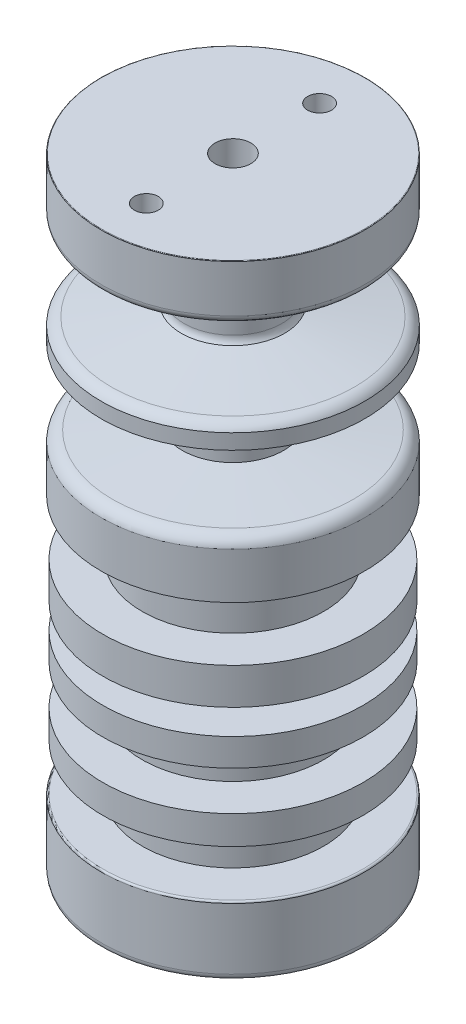
ISO-10303-21;
HEADER;
FILE_DESCRIPTION(('STEP AP214'),'2;1');
FILE_NAME('part.step','',(''),(''),'','','');
FILE_SCHEMA(('AUTOMOTIVE_DESIGN { 1 0 10303 214 1 1 1 1 }'));
ENDSEC;
DATA;
#1=APPLICATION_CONTEXT('core data for automotive mechanical design processes');
#2=APPLICATION_PROTOCOL_DEFINITION('international standard','automotive_design',2000,#1);
#3=PRODUCT_CONTEXT('',#1,'mechanical');
#4=PRODUCT('Part','Part','',(#3));
#5=PRODUCT_RELATED_PRODUCT_CATEGORY('part','',(#4));
#6=PRODUCT_DEFINITION_FORMATION('','',#4);
#7=PRODUCT_DEFINITION_CONTEXT('part definition',#1,'design');
#8=PRODUCT_DEFINITION('design','',#6,#7);
#9=PRODUCT_DEFINITION_SHAPE('','',#8);
#10=(LENGTH_UNIT() NAMED_UNIT(*) SI_UNIT(.MILLI.,.METRE.));
#11=(NAMED_UNIT(*) PLANE_ANGLE_UNIT() SI_UNIT($,.RADIAN.));
#12=(NAMED_UNIT(*) SI_UNIT($,.STERADIAN.) SOLID_ANGLE_UNIT());
#13=UNCERTAINTY_MEASURE_WITH_UNIT(LENGTH_MEASURE(1.E-05),#10,'distance_accuracy_value','');
#14=(GEOMETRIC_REPRESENTATION_CONTEXT(3) GLOBAL_UNCERTAINTY_ASSIGNED_CONTEXT((#13)) GLOBAL_UNIT_ASSIGNED_CONTEXT((#10,
#11,#12)) REPRESENTATION_CONTEXT('',''));
#15=CARTESIAN_POINT('',(0.,0.,0.));
#16=DIRECTION('',(0.,0.,1.));
#17=DIRECTION('',(1.,0.,0.));
#18=AXIS2_PLACEMENT_3D('',#15,#16,#17);
#19=CARTESIAN_POINT('',(0.,-121.955431754864,0.));
#20=DIRECTION('',(0.,-1.,0.));
#21=DIRECTION('',(1.,0.,0.));
#22=AXIS2_PLACEMENT_3D('',#19,#20,#21);
#23=CONICAL_SURFACE('',#22,0.,1.56977202903622);
#24=CARTESIAN_POINT('',(0.,-121.991013624139,0.));
#25=DIRECTION('',(0.,1.,0.));
#26=DIRECTION('',(-1.,0.,0.));
#27=AXIS2_PLACEMENT_3D('',#24,#25,#26);
#28=CIRCLE('',#27,34.7378060037741);
#29=CARTESIAN_POINT('',(34.7378060037709,-121.991013624139,0.));
#30=VERTEX_POINT('',#29);
#31=EDGE_CURVE('E137',#30,#30,#28,.T.);
#32=CARTESIAN_POINT('',(0.,-121.963562121167,0.));
#33=DIRECTION('',(0.,-1.,0.));
#34=DIRECTION('',(1.,0.,0.));
#35=AXIS2_PLACEMENT_3D('',#32,#33,#34);
#36=CIRCLE('',#35,7.9375);
#37=CARTESIAN_POINT('',(7.93749999999986,-121.963562121167,0.));
#38=VERTEX_POINT('',#37);
#39=EDGE_CURVE('E37',#38,#38,#36,.T.);
#40=CARTESIAN_POINT('',(34.7378060037709,-121.991013624139,0.));
#41=CARTESIAN_POINT('',(34.4586361495649,-121.990727670983,0.));
#42=CARTESIAN_POINT('',(34.179466295359,-121.990441717827,0.));
#43=CARTESIAN_POINT('',(33.6211265869471,-121.989869811515,0.));
#44=CARTESIAN_POINT('',(33.3419567327411,-121.989583858359,0.));
#45=CARTESIAN_POINT('',(32.7836170243292,-121.989011952047,0.));
#46=CARTESIAN_POINT('',(32.5044471701233,-121.988725998891,0.));
#47=CARTESIAN_POINT('',(31.9461074617114,-121.988154092579,0.));
#48=CARTESIAN_POINT('',(31.6669376075054,-121.987868139423,0.));
#49=CARTESIAN_POINT('',(31.1085978990935,-121.987296233111,0.));
#50=CARTESIAN_POINT('',(30.8294280448876,-121.987010279955,0.));
#51=CARTESIAN_POINT('',(30.2710883364757,-121.986438373643,0.));
#52=CARTESIAN_POINT('',(29.9919184822697,-121.986152420487,0.));
#53=CARTESIAN_POINT('',(29.4335787738579,-121.985580514175,0.));
#54=CARTESIAN_POINT('',(29.1544089196519,-121.985294561019,0.));
#55=CARTESIAN_POINT('',(28.59606921124,-121.984722654708,0.));
#56=CARTESIAN_POINT('',(28.3168993570341,-121.984436701552,0.));
#57=CARTESIAN_POINT('',(27.7585596486222,-121.98386479524,0.));
#58=CARTESIAN_POINT('',(27.4793897944162,-121.983578842084,0.));
#59=CARTESIAN_POINT('',(26.9210500860043,-121.983006935772,0.));
#60=CARTESIAN_POINT('',(26.6418802317984,-121.982720982616,0.));
#61=CARTESIAN_POINT('',(26.0835405233865,-121.982149076304,0.));
#62=CARTESIAN_POINT('',(25.8043706691805,-121.981863123148,0.));
#63=CARTESIAN_POINT('',(25.2460309607686,-121.981291216836,0.));
#64=CARTESIAN_POINT('',(24.9668611065627,-121.98100526368,0.));
#65=CARTESIAN_POINT('',(24.4085213981508,-121.980433357368,0.));
#66=CARTESIAN_POINT('',(24.1293515439448,-121.980147404212,0.));
#67=CARTESIAN_POINT('',(23.5710118355329,-121.9795754979,0.));
#68=CARTESIAN_POINT('',(23.291841981327,-121.979289544744,0.));
#69=CARTESIAN_POINT('',(22.7335022729151,-121.978717638432,0.));
#70=CARTESIAN_POINT('',(22.4543324187092,-121.978431685276,0.));
#71=CARTESIAN_POINT('',(21.8959927102973,-121.977859778965,0.));
#72=CARTESIAN_POINT('',(21.6168228560913,-121.977573825809,0.));
#73=CARTESIAN_POINT('',(21.0584831476794,-121.977001919497,0.));
#74=CARTESIAN_POINT('',(20.7793132934735,-121.976715966341,0.));
#75=CARTESIAN_POINT('',(20.2209735850616,-121.976144060029,0.));
#76=CARTESIAN_POINT('',(19.9418037308556,-121.975858106873,0.));
#77=CARTESIAN_POINT('',(19.3834640224437,-121.975286200561,0.));
#78=CARTESIAN_POINT('',(19.1042941682378,-121.975000247405,0.));
#79=CARTESIAN_POINT('',(18.5459544598259,-121.974428341093,0.));
#80=CARTESIAN_POINT('',(18.2667846056199,-121.974142387937,0.));
#81=CARTESIAN_POINT('',(17.708444897208,-121.973570481625,0.));
#82=CARTESIAN_POINT('',(17.4292750430021,-121.973284528469,0.));
#83=CARTESIAN_POINT('',(16.8709353345902,-121.972712622157,0.));
#84=CARTESIAN_POINT('',(16.5917654803842,-121.972426669001,0.));
#85=CARTESIAN_POINT('',(16.0334257719724,-121.971854762689,0.));
#86=CARTESIAN_POINT('',(15.7542559177664,-121.971568809533,0.));
#87=CARTESIAN_POINT('',(15.1959162093545,-121.970996903221,0.));
#88=CARTESIAN_POINT('',(14.9167463551486,-121.970710950066,0.));
#89=CARTESIAN_POINT('',(14.3584066467367,-121.970139043754,0.));
#90=CARTESIAN_POINT('',(14.0792367925307,-121.969853090598,0.));
#91=CARTESIAN_POINT('',(13.5208970841188,-121.969281184286,0.));
#92=CARTESIAN_POINT('',(13.2417272299129,-121.96899523113,0.));
#93=CARTESIAN_POINT('',(12.683387521501,-121.968423324818,0.));
#94=CARTESIAN_POINT('',(12.404217667295,-121.968137371662,0.));
#95=CARTESIAN_POINT('',(11.8458779588831,-121.96756546535,0.));
#96=CARTESIAN_POINT('',(11.5667081046772,-121.967279512194,0.));
#97=CARTESIAN_POINT('',(11.0083683962653,-121.966707605882,0.));
#98=CARTESIAN_POINT('',(10.7291985420593,-121.966421652726,0.));
#99=CARTESIAN_POINT('',(10.1708588336474,-121.965849746414,0.));
#100=CARTESIAN_POINT('',(9.8916889794415,-121.965563793258,0.));
#101=CARTESIAN_POINT('',(9.3333492710296,-121.964991886946,0.));
#102=CARTESIAN_POINT('',(9.05417941682365,-121.96470593379,0.));
#103=CARTESIAN_POINT('',(8.49583970841176,-121.964134027478,0.));
#104=CARTESIAN_POINT('',(8.21666985420581,-121.963848074323,0.));
#105=CARTESIAN_POINT('',(7.93749999999986,-121.963562121167,0.));
#106=B_SPLINE_CURVE_WITH_KNOTS('',3,(#40,#41,#42,#43,#44,#45,#46,#47,#48,#49,#50,#51,#52,#53,
#54,#55,#56,#57,#58,#59,#60,#61,#62,#63,#64,#65,#66,#67,#68,#69,#70,#71,#72,#73,#74,#75,#76,#77,
#78,#79,#80,#81,#82,#83,#84,#85,#86,#87,#88,#89,#90,#91,#92,#93,#94,#95,#96,#97,#98,#99,#100,
#101,#102,#103,#104,#105),.UNSPECIFIED.,.F.,.F.,(4,2,2,2,2,2,2,2,2,2,2,2,2,2,2,2,2,2,2,2,2,2,2,
2,2,2,2,2,2,2,2,2,4),(0.,0.837510001969652,1.6750200039393,2.51253000590894,3.35004000787859,
4.18755000984824,5.02506001181789,5.86257001378753,6.70008001575718,7.53759001772683,
8.37510001969648,9.21261002166612,10.0501200236358,10.8876300256054,11.7251400275751,
12.5626500295447,13.4001600315144,14.237670033484,15.0751800354537,15.9126900374233,
16.7502000393929,17.5877100413626,18.4252200433322,19.2627300453019,20.1002400472715,
20.9377500492412,21.7752600512108,22.6127700531805,23.4502800551501,24.2877900571198,
25.1253000590894,25.9628100610591,26.8003200630287),.UNSPECIFIED.);
#107=EDGE_CURVE('BSEAM33',#30,#38,#106,.T.);
#108=ORIENTED_EDGE('',*,*,#31,.F.);
#109=ORIENTED_EDGE('',*,*,#39,.F.);
#110=ORIENTED_EDGE('',*,*,#107,.T.);
#111=ORIENTED_EDGE('',*,*,#107,.F.);
#112=EDGE_LOOP('',(#108,#110,#109,#111));
#113=FACE_BOUND('',#112,.T.);
#114=ADVANCED_FACE('F33',(#113),#23,.F.);
#115=CARTESIAN_POINT('',(0.,43.0445682451364,0.));
#116=DIRECTION('',(0.,-1.,0.));
#117=DIRECTION('',(1.,0.,0.));
#118=AXIS2_PLACEMENT_3D('',#115,#116,#117);
#119=PLANE('',#118);
#120=CARTESIAN_POINT('',(0.,43.0445682451364,0.));
#121=DIRECTION('',(0.,1.,0.));
#122=DIRECTION('',(0.,0.,1.));
#123=AXIS2_PLACEMENT_3D('',#120,#121,#122);
#124=CIRCLE('',#123,4.7625);
#125=CARTESIAN_POINT('',(0.,43.0445682451364,4.7625));
#126=VERTEX_POINT('',#125);
#127=EDGE_CURVE('E153',#126,#126,#124,.T.);
#128=ORIENTED_EDGE('',*,*,#127,.F.);
#129=EDGE_LOOP('',(#128));
#130=FACE_BOUND('',#129,.T.);
#131=CARTESIAN_POINT('',(0.,43.0445682451364,23.));
#132=DIRECTION('',(0.,1.,0.));
#133=DIRECTION('',(0.,0.,1.));
#134=AXIS2_PLACEMENT_3D('',#131,#132,#133);
#135=CIRCLE('',#134,3.175);
#136=CARTESIAN_POINT('',(0.,43.0445682451364,26.175));
#137=VERTEX_POINT('',#136);
#138=EDGE_CURVE('E147',#137,#137,#135,.T.);
#139=ORIENTED_EDGE('',*,*,#138,.F.);
#140=EDGE_LOOP('',(#139));
#141=FACE_BOUND('',#140,.T.);
#142=CARTESIAN_POINT('',(0.,43.0445682451364,-23.));
#143=DIRECTION('',(0.,1.,0.));
#144=DIRECTION('',(0.,0.,1.));
#145=AXIS2_PLACEMENT_3D('',#142,#143,#144);
#146=CIRCLE('',#145,3.175);
#147=CARTESIAN_POINT('',(0.,43.0445682451364,-19.825));
#148=VERTEX_POINT('',#147);
#149=EDGE_CURVE('E141',#148,#148,#146,.T.);
#150=ORIENTED_EDGE('',*,*,#149,.F.);
#151=EDGE_LOOP('',(#150));
#152=FACE_BOUND('',#151,.T.);
#153=CARTESIAN_POINT('',(0.,43.0445682451364,0.));
#154=DIRECTION('',(0.,1.,0.));
#155=DIRECTION('',(-1.,0.,0.));
#156=AXIS2_PLACEMENT_3D('',#153,#154,#155);
#157=CIRCLE('',#156,34.8584196821975);
#158=CARTESIAN_POINT('',(-34.8584196821975,43.0445682451364,0.));
#159=VERTEX_POINT('',#158);
#160=EDGE_CURVE('E10',#159,#159,#157,.T.);
#161=ORIENTED_EDGE('',*,*,#160,.T.);
#162=EDGE_LOOP('',(#161));
#163=FACE_BOUND('',#162,.T.);
#164=ADVANCED_FACE('F35',(#130,#141,#152,#163),#119,.F.);
#165=CARTESIAN_POINT('',(0.,42.9029879273339,0.));
#166=DIRECTION('',(0.,1.,0.));
#167=DIRECTION('',(-1.,0.,0.));
#168=AXIS2_PLACEMENT_3D('',#165,#166,#167);
#169=TOROIDAL_SURFACE('',#168,34.8584196821975,0.141580317802481);
#170=ORIENTED_EDGE('',*,*,#160,.F.);
#171=EDGE_LOOP('',(#170));
#172=FACE_BOUND('',#171,.T.);
#173=CARTESIAN_POINT('',(0.,42.9029879273339,0.));
#174=DIRECTION('',(0.,1.,0.));
#175=DIRECTION('',(-1.,0.,0.));
#176=AXIS2_PLACEMENT_3D('',#173,#174,#175);
#177=CIRCLE('',#176,35.);
#178=CARTESIAN_POINT('',(-35.,42.9029879273339,0.));
#179=VERTEX_POINT('',#178);
#180=EDGE_CURVE('E41',#179,#179,#177,.T.);
#181=ORIENTED_EDGE('',*,*,#180,.T.);
#182=EDGE_LOOP('',(#181));
#183=FACE_BOUND('',#182,.T.);
#184=ADVANCED_FACE('F173',(#172,#183),#169,.T.);
#185=CARTESIAN_POINT('',(0.,43.0445682451364,0.));
#186=DIRECTION('',(0.,1.,0.));
#187=DIRECTION('',(-1.,0.,0.));
#188=AXIS2_PLACEMENT_3D('',#185,#186,#187);
#189=CYLINDRICAL_SURFACE('',#188,35.);
#190=ORIENTED_EDGE('',*,*,#180,.F.);
#191=EDGE_LOOP('',(#190));
#192=FACE_BOUND('',#191,.T.);
#193=CARTESIAN_POINT('',(0.,30.3660149299546,0.));
#194=DIRECTION('',(0.,1.,0.));
#195=DIRECTION('',(-1.,0.,0.));
#196=AXIS2_PLACEMENT_3D('',#193,#194,#195);
#197=CIRCLE('',#196,35.);
#198=CARTESIAN_POINT('',(-35.,30.3660149299546,0.));
#199=VERTEX_POINT('',#198);
#200=EDGE_CURVE('E45',#199,#199,#197,.T.);
#201=ORIENTED_EDGE('',*,*,#200,.T.);
#202=EDGE_LOOP('',(#201));
#203=FACE_BOUND('',#202,.T.);
#204=ADVANCED_FACE('F299',(#192,#203),#189,.T.);
#205=CARTESIAN_POINT('',(0.,30.3660149299546,0.));
#206=DIRECTION('',(0.,1.,0.));
#207=DIRECTION('',(-1.,0.,0.));
#208=AXIS2_PLACEMENT_3D('',#205,#206,#207);
#209=TOROIDAL_SURFACE('',#208,32.9643531045201,2.03564689547988);
#210=ORIENTED_EDGE('',*,*,#200,.F.);
#211=EDGE_LOOP('',(#210));
#212=FACE_BOUND('',#211,.T.);
#213=CARTESIAN_POINT('',(0.,28.3303680344748,0.));
#214=DIRECTION('',(0.,1.,0.));
#215=DIRECTION('',(-1.,0.,0.));
#216=AXIS2_PLACEMENT_3D('',#213,#214,#215);
#217=CIRCLE('',#216,32.9643531045201);
#218=CARTESIAN_POINT('',(-32.9643531045201,28.3303680344747,0.));
#219=VERTEX_POINT('',#218);
#220=EDGE_CURVE('E50',#219,#219,#217,.T.);
#221=ORIENTED_EDGE('',*,*,#220,.T.);
#222=EDGE_LOOP('',(#221));
#223=FACE_BOUND('',#222,.T.);
#224=ADVANCED_FACE('F295',(#212,#223),#209,.T.);
#225=CARTESIAN_POINT('',(32.9643531045201,28.3303680344748,0.));
#226=DIRECTION('',(0.,1.,0.));
#227=DIRECTION('',(-1.,0.,0.));
#228=AXIS2_PLACEMENT_3D('',#225,#226,#227);
#229=PLANE('',#228);
#230=ORIENTED_EDGE('',*,*,#220,.F.);
#231=EDGE_LOOP('',(#230));
#232=FACE_BOUND('',#231,.T.);
#233=CARTESIAN_POINT('',(0.,28.3303680344748,0.));
#234=DIRECTION('',(0.,1.,0.));
#235=DIRECTION('',(-1.,0.,0.));
#236=AXIS2_PLACEMENT_3D('',#233,#234,#235);
#237=CIRCLE('',#236,12.9857969124329);
#238=CARTESIAN_POINT('',(-12.9857969124329,28.3303680344748,0.));
#239=VERTEX_POINT('',#238);
#240=EDGE_CURVE('E53',#239,#239,#237,.T.);
#241=ORIENTED_EDGE('',*,*,#240,.T.);
#242=EDGE_LOOP('',(#241));
#243=FACE_BOUND('',#242,.T.);
#244=ADVANCED_FACE('F291',(#232,#243),#229,.F.);
#245=CARTESIAN_POINT('',(0.,43.0445682451364,0.));
#246=DIRECTION('',(0.,1.,0.));
#247=DIRECTION('',(-1.,0.,0.));
#248=AXIS2_PLACEMENT_3D('',#245,#246,#247);
#249=CYLINDRICAL_SURFACE('',#248,12.9857969124329);
#250=ORIENTED_EDGE('',*,*,#240,.F.);
#251=EDGE_LOOP('',(#250));
#252=FACE_BOUND('',#251,.T.);
#253=CARTESIAN_POINT('',(0.,10.4062076007876,0.));
#254=DIRECTION('',(0.,1.,0.));
#255=DIRECTION('',(-1.,0.,0.));
#256=AXIS2_PLACEMENT_3D('',#253,#254,#255);
#257=CIRCLE('',#256,12.9857969124329);
#258=CARTESIAN_POINT('',(-12.9857969124329,10.4062076007876,0.));
#259=VERTEX_POINT('',#258);
#260=EDGE_CURVE('E56',#259,#259,#257,.T.);
#261=ORIENTED_EDGE('',*,*,#260,.T.);
#262=EDGE_LOOP('',(#261));
#263=FACE_BOUND('',#262,.T.);
#264=ADVANCED_FACE('F287',(#252,#263),#249,.T.);
#265=CARTESIAN_POINT('',(0.,10.4062076007876,0.));
#266=DIRECTION('',(0.,1.,0.));
#267=DIRECTION('',(-1.,0.,0.));
#268=AXIS2_PLACEMENT_3D('',#265,#266,#267);
#269=TOROIDAL_SURFACE('',#268,15.8008154382432,2.81501852581031);
#270=ORIENTED_EDGE('',*,*,#260,.F.);
#271=EDGE_LOOP('',(#270));
#272=FACE_BOUND('',#271,.T.);
#273=CARTESIAN_POINT('',(0.,8.51251271153448,0.));
#274=DIRECTION('',(0.,1.,0.));
#275=DIRECTION('',(-1.,0.,0.));
#276=AXIS2_PLACEMENT_3D('',#273,#274,#275);
#277=CIRCLE('',#276,13.7179690763931);
#278=CARTESIAN_POINT('',(-13.7179690763931,8.51251271153447,0.));
#279=VERTEX_POINT('',#278);
#280=EDGE_CURVE('E59',#279,#279,#277,.T.);
#281=ORIENTED_EDGE('',*,*,#280,.T.);
#282=EDGE_LOOP('',(#281));
#283=FACE_BOUND('',#282,.T.);
#284=ADVANCED_FACE('F283',(#272,#283),#269,.F.);
#285=CARTESIAN_POINT('',(0.,5.48596194522862,0.));
#286=DIRECTION('',(0.,-1.,0.));
#287=DIRECTION('',(1.,0.,0.));
#288=AXIS2_PLACEMENT_3D('',#285,#286,#287);
#289=CONICAL_SURFACE('',#288,32.3097448153254,1.40942212691776);
#290=ORIENTED_EDGE('',*,*,#280,.F.);
#291=EDGE_LOOP('',(#290));
#292=FACE_BOUND('',#291,.T.);
#293=CARTESIAN_POINT('',(0.,5.48596194522862,0.));
#294=DIRECTION('',(0.,1.,0.));
#295=DIRECTION('',(-1.,0.,0.));
#296=AXIS2_PLACEMENT_3D('',#293,#294,#295);
#297=CIRCLE('',#296,32.3097448153254);
#298=CARTESIAN_POINT('',(-32.3097448153254,5.48596194522862,0.));
#299=VERTEX_POINT('',#298);
#300=EDGE_CURVE('E62',#299,#299,#297,.T.);
#301=ORIENTED_EDGE('',*,*,#300,.T.);
#302=EDGE_LOOP('',(#301));
#303=FACE_BOUND('',#302,.T.);
#304=ADVANCED_FACE('F279',(#292,#303),#289,.T.);
#305=CARTESIAN_POINT('',(0.,1.82897337850735,0.));
#306=DIRECTION('',(0.,1.,0.));
#307=DIRECTION('',(-1.,0.,0.));
#308=AXIS2_PLACEMENT_3D('',#305,#306,#307);
#309=TOROIDAL_SURFACE('',#308,31.714424513252,3.7051277493753);
#310=ORIENTED_EDGE('',*,*,#300,.F.);
#311=EDGE_LOOP('',(#310));
#312=FACE_BOUND('',#311,.T.);
#313=CARTESIAN_POINT('',(0.,3.54156362724511,0.));
#314=DIRECTION('',(0.,1.,0.));
#315=DIRECTION('',(-1.,0.,0.));
#316=AXIS2_PLACEMENT_3D('',#313,#314,#315);
#317=CIRCLE('',#316,35.);
#318=CARTESIAN_POINT('',(-35.,3.54156362724511,0.));
#319=VERTEX_POINT('',#318);
#320=EDGE_CURVE('E65',#319,#319,#317,.T.);
#321=ORIENTED_EDGE('',*,*,#320,.T.);
#322=EDGE_LOOP('',(#321));
#323=FACE_BOUND('',#322,.T.);
#324=ADVANCED_FACE('F275',(#312,#323),#309,.T.);
#325=CARTESIAN_POINT('',(0.,43.0445682451364,0.));
#326=DIRECTION('',(0.,1.,0.));
#327=DIRECTION('',(-1.,0.,0.));
#328=AXIS2_PLACEMENT_3D('',#325,#326,#327);
#329=CYLINDRICAL_SURFACE('',#328,35.);
#330=ORIENTED_EDGE('',*,*,#320,.F.);
#331=EDGE_LOOP('',(#330));
#332=FACE_BOUND('',#331,.T.);
#333=CARTESIAN_POINT('',(0.,-0.490098714239634,0.));
#334=DIRECTION('',(0.,1.,0.));
#335=DIRECTION('',(-1.,0.,0.));
#336=AXIS2_PLACEMENT_3D('',#333,#334,#335);
#337=CIRCLE('',#336,35.);
#338=CARTESIAN_POINT('',(-35.,-0.490098714239638,0.));
#339=VERTEX_POINT('',#338);
#340=EDGE_CURVE('E68',#339,#339,#337,.T.);
#341=ORIENTED_EDGE('',*,*,#340,.T.);
#342=EDGE_LOOP('',(#341));
#343=FACE_BOUND('',#342,.T.);
#344=ADVANCED_FACE('F271',(#332,#343),#329,.T.);
#345=CARTESIAN_POINT('',(13.4687354882585,-0.490098714239631,0.));
#346=DIRECTION('',(0.,1.,0.));
#347=DIRECTION('',(-1.,0.,0.));
#348=AXIS2_PLACEMENT_3D('',#345,#346,#347);
#349=PLANE('',#348);
#350=ORIENTED_EDGE('',*,*,#340,.F.);
#351=EDGE_LOOP('',(#350));
#352=FACE_BOUND('',#351,.T.);
#353=CARTESIAN_POINT('',(0.,-0.490098714239634,0.));
#354=DIRECTION('',(0.,1.,0.));
#355=DIRECTION('',(-1.,0.,0.));
#356=AXIS2_PLACEMENT_3D('',#353,#354,#355);
#357=CIRCLE('',#356,13.4687354882585);
#358=CARTESIAN_POINT('',(-13.4687354882585,-0.490098714239636,0.));
#359=VERTEX_POINT('',#358);
#360=EDGE_CURVE('E71',#359,#359,#357,.T.);
#361=ORIENTED_EDGE('',*,*,#360,.T.);
#362=EDGE_LOOP('',(#361));
#363=FACE_BOUND('',#362,.T.);
#364=ADVANCED_FACE('F267',(#352,#363),#349,.F.);
#365=CARTESIAN_POINT('',(0.,43.0445682451364,0.));
#366=DIRECTION('',(0.,1.,0.));
#367=DIRECTION('',(-1.,0.,0.));
#368=AXIS2_PLACEMENT_3D('',#365,#366,#367);
#369=CYLINDRICAL_SURFACE('',#368,13.4687354882585);
#370=ORIENTED_EDGE('',*,*,#360,.F.);
#371=EDGE_LOOP('',(#370));
#372=FACE_BOUND('',#371,.T.);
#373=CARTESIAN_POINT('',(0.,-18.538757945872,0.));
#374=DIRECTION('',(0.,1.,0.));
#375=DIRECTION('',(-1.,0.,0.));
#376=AXIS2_PLACEMENT_3D('',#373,#374,#375);
#377=CIRCLE('',#376,13.4687354882585);
#378=CARTESIAN_POINT('',(-13.4687354882585,-18.538757945872,0.));
#379=VERTEX_POINT('',#378);
#380=EDGE_CURVE('E74',#379,#379,#377,.T.);
#381=ORIENTED_EDGE('',*,*,#380,.T.);
#382=EDGE_LOOP('',(#381));
#383=FACE_BOUND('',#382,.T.);
#384=ADVANCED_FACE('F263',(#372,#383),#369,.T.);
#385=CARTESIAN_POINT('',(0.,-20.5131962872159,0.));
#386=DIRECTION('',(0.,-1.,0.));
#387=DIRECTION('',(1.,0.,0.));
#388=AXIS2_PLACEMENT_3D('',#385,#386,#387);
#389=CONICAL_SURFACE('',#388,31.9792266270137,1.46453221422253);
#390=ORIENTED_EDGE('',*,*,#380,.F.);
#391=EDGE_LOOP('',(#390));
#392=FACE_BOUND('',#391,.T.);
#393=CARTESIAN_POINT('',(0.,-20.5131962872159,0.));
#394=DIRECTION('',(0.,1.,0.));
#395=DIRECTION('',(-1.,0.,0.));
#396=AXIS2_PLACEMENT_3D('',#393,#394,#395);
#397=CIRCLE('',#396,31.9792266270137);
#398=CARTESIAN_POINT('',(-31.9792266270137,-20.5131962872159,0.));
#399=VERTEX_POINT('',#398);
#400=EDGE_CURVE('E77',#399,#399,#397,.T.);
#401=ORIENTED_EDGE('',*,*,#400,.T.);
#402=EDGE_LOOP('',(#401));
#403=FACE_BOUND('',#402,.T.);
#404=ADVANCED_FACE('F259',(#392,#403),#389,.T.);
#405=CARTESIAN_POINT('',(0.,-23.9615059492109,0.));
#406=DIRECTION('',(0.,1.,0.));
#407=DIRECTION('',(-1.,0.,0.));
#408=AXIS2_PLACEMENT_3D('',#405,#406,#407);
#409=TOROIDAL_SURFACE('',#408,31.6114095465033,3.46787095055789);
#410=ORIENTED_EDGE('',*,*,#400,.F.);
#411=EDGE_LOOP('',(#410));
#412=FACE_BOUND('',#411,.T.);
#413=CARTESIAN_POINT('',(0.,-23.2242246811764,0.));
#414=DIRECTION('',(0.,1.,0.));
#415=DIRECTION('',(-1.,0.,0.));
#416=AXIS2_PLACEMENT_3D('',#413,#414,#415);
#417=CIRCLE('',#416,35.);
#418=CARTESIAN_POINT('',(-35.,-23.2242246811764,0.));
#419=VERTEX_POINT('',#418);
#420=EDGE_CURVE('E80',#419,#419,#417,.T.);
#421=ORIENTED_EDGE('',*,*,#420,.T.);
#422=EDGE_LOOP('',(#421));
#423=FACE_BOUND('',#422,.T.);
#424=ADVANCED_FACE('F255',(#412,#423),#409,.T.);
#425=CARTESIAN_POINT('',(0.,43.0445682451364,0.));
#426=DIRECTION('',(0.,1.,0.));
#427=DIRECTION('',(-1.,0.,0.));
#428=AXIS2_PLACEMENT_3D('',#425,#426,#427);
#429=CYLINDRICAL_SURFACE('',#428,35.);
#430=ORIENTED_EDGE('',*,*,#420,.F.);
#431=EDGE_LOOP('',(#430));
#432=FACE_BOUND('',#431,.T.);
#433=CARTESIAN_POINT('',(0.,-35.501069654203,0.));
#434=DIRECTION('',(0.,1.,0.));
#435=DIRECTION('',(-1.,0.,0.));
#436=AXIS2_PLACEMENT_3D('',#433,#434,#435);
#437=CIRCLE('',#436,35.);
#438=CARTESIAN_POINT('',(-35.,-35.501069654203,0.));
#439=VERTEX_POINT('',#438);
#440=EDGE_CURVE('E83',#439,#439,#437,.T.);
#441=ORIENTED_EDGE('',*,*,#440,.T.);
#442=EDGE_LOOP('',(#441));
#443=FACE_BOUND('',#442,.T.);
#444=ADVANCED_FACE('F251',(#432,#443),#429,.T.);
#445=CARTESIAN_POINT('',(35.,-35.501069654203,0.));
#446=DIRECTION('',(0.,1.,0.));
#447=DIRECTION('',(-1.,0.,0.));
#448=AXIS2_PLACEMENT_3D('',#445,#446,#447);
#449=PLANE('',#448);
#450=ORIENTED_EDGE('',*,*,#440,.F.);
#451=EDGE_LOOP('',(#450));
#452=FACE_BOUND('',#451,.T.);
#453=CARTESIAN_POINT('',(0.,-35.501069654203,0.));
#454=DIRECTION('',(0.,1.,0.));
#455=DIRECTION('',(-1.,0.,0.));
#456=AXIS2_PLACEMENT_3D('',#453,#454,#455);
#457=CIRCLE('',#456,24.0860533652923);
#458=CARTESIAN_POINT('',(-24.0860533652923,-35.501069654203,0.));
#459=VERTEX_POINT('',#458);
#460=EDGE_CURVE('E86',#459,#459,#457,.T.);
#461=ORIENTED_EDGE('',*,*,#460,.T.);
#462=EDGE_LOOP('',(#461));
#463=FACE_BOUND('',#462,.T.);
#464=ADVANCED_FACE('F247',(#452,#463),#449,.F.);
#465=CARTESIAN_POINT('',(0.,43.0445682451364,0.));
#466=DIRECTION('',(0.,1.,0.));
#467=DIRECTION('',(-1.,0.,0.));
#468=AXIS2_PLACEMENT_3D('',#465,#466,#467);
#469=CYLINDRICAL_SURFACE('',#468,24.0860533652923);
#470=ORIENTED_EDGE('',*,*,#460,.F.);
#471=EDGE_LOOP('',(#470));
#472=FACE_BOUND('',#471,.T.);
#473=CARTESIAN_POINT('',(0.,-50.2632732960367,0.));
#474=DIRECTION('',(0.,1.,0.));
#475=DIRECTION('',(-1.,0.,0.));
#476=AXIS2_PLACEMENT_3D('',#473,#474,#475);
#477=CIRCLE('',#476,24.0860533652923);
#478=CARTESIAN_POINT('',(-24.0860533652923,-50.2632732960367,0.));
#479=VERTEX_POINT('',#478);
#480=EDGE_CURVE('E89',#479,#479,#477,.T.);
#481=ORIENTED_EDGE('',*,*,#480,.T.);
#482=EDGE_LOOP('',(#481));
#483=FACE_BOUND('',#482,.T.);
#484=ADVANCED_FACE('F243',(#472,#483),#469,.T.);
#485=CARTESIAN_POINT('',(34.5383420831025,-50.2632732960367,0.));
#486=DIRECTION('',(0.,-1.,0.));
#487=DIRECTION('',(1.,0.,0.));
#488=AXIS2_PLACEMENT_3D('',#485,#486,#487);
#489=PLANE('',#488);
#490=ORIENTED_EDGE('',*,*,#480,.F.);
#491=EDGE_LOOP('',(#490));
#492=FACE_BOUND('',#491,.T.);
#493=CARTESIAN_POINT('',(0.,-50.2632732960367,0.));
#494=DIRECTION('',(0.,1.,0.));
#495=DIRECTION('',(-1.,0.,0.));
#496=AXIS2_PLACEMENT_3D('',#493,#494,#495);
#497=CIRCLE('',#496,34.5383420831025);
#498=CARTESIAN_POINT('',(-34.5383420831025,-50.2632732960367,0.));
#499=VERTEX_POINT('',#498);
#500=EDGE_CURVE('E92',#499,#499,#497,.T.);
#501=ORIENTED_EDGE('',*,*,#500,.T.);
#502=EDGE_LOOP('',(#501));
#503=FACE_BOUND('',#502,.T.);
#504=ADVANCED_FACE('F239',(#492,#503),#489,.F.);
#505=CARTESIAN_POINT('',(0.,43.0445682451364,0.));
#506=DIRECTION('',(0.,1.,0.));
#507=DIRECTION('',(-1.,0.,0.));
#508=AXIS2_PLACEMENT_3D('',#505,#506,#507);
#509=CYLINDRICAL_SURFACE('',#508,34.5383420831025);
#510=ORIENTED_EDGE('',*,*,#500,.F.);
#511=EDGE_LOOP('',(#510));
#512=FACE_BOUND('',#511,.T.);
#513=CARTESIAN_POINT('',(0.,-59.9179333119601,0.));
#514=DIRECTION('',(0.,1.,0.));
#515=DIRECTION('',(-1.,0.,0.));
#516=AXIS2_PLACEMENT_3D('',#513,#514,#515);
#517=CIRCLE('',#516,34.5383420831025);
#518=CARTESIAN_POINT('',(-34.5383420831025,-59.9179333119601,0.));
#519=VERTEX_POINT('',#518);
#520=EDGE_CURVE('E95',#519,#519,#517,.T.);
#521=ORIENTED_EDGE('',*,*,#520,.T.);
#522=EDGE_LOOP('',(#521));
#523=FACE_BOUND('',#522,.T.);
#524=ADVANCED_FACE('F235',(#512,#523),#509,.T.);
#525=CARTESIAN_POINT('',(24.0860533652924,-59.9179333119601,0.));
#526=DIRECTION('',(0.,1.,0.));
#527=DIRECTION('',(-1.,0.,0.));
#528=AXIS2_PLACEMENT_3D('',#525,#526,#527);
#529=PLANE('',#528);
#530=ORIENTED_EDGE('',*,*,#520,.F.);
#531=EDGE_LOOP('',(#530));
#532=FACE_BOUND('',#531,.T.);
#533=CARTESIAN_POINT('',(0.,-59.9179333119601,0.));
#534=DIRECTION('',(0.,1.,0.));
#535=DIRECTION('',(-1.,0.,0.));
#536=AXIS2_PLACEMENT_3D('',#533,#534,#535);
#537=CIRCLE('',#536,24.0860533652923);
#538=CARTESIAN_POINT('',(-24.0860533652923,-59.9179333119601,0.));
#539=VERTEX_POINT('',#538);
#540=EDGE_CURVE('E98',#539,#539,#537,.T.);
#541=ORIENTED_EDGE('',*,*,#540,.T.);
#542=EDGE_LOOP('',(#541));
#543=FACE_BOUND('',#542,.T.);
#544=ADVANCED_FACE('F231',(#532,#543),#529,.F.);
#545=CARTESIAN_POINT('',(0.,43.0445682451364,0.));
#546=DIRECTION('',(0.,1.,0.));
#547=DIRECTION('',(-1.,0.,0.));
#548=AXIS2_PLACEMENT_3D('',#545,#546,#547);
#549=CYLINDRICAL_SURFACE('',#548,24.0860533652923);
#550=ORIENTED_EDGE('',*,*,#540,.F.);
#551=EDGE_LOOP('',(#550));
#552=FACE_BOUND('',#551,.T.);
#553=CARTESIAN_POINT('',(0.,-66.6170851597436,0.));
#554=DIRECTION('',(0.,1.,0.));
#555=DIRECTION('',(-1.,0.,0.));
#556=AXIS2_PLACEMENT_3D('',#553,#554,#555);
#557=CIRCLE('',#556,24.0860533652923);
#558=CARTESIAN_POINT('',(-24.0860533652923,-66.6170851597436,0.));
#559=VERTEX_POINT('',#558);
#560=EDGE_CURVE('E101',#559,#559,#557,.T.);
#561=ORIENTED_EDGE('',*,*,#560,.T.);
#562=EDGE_LOOP('',(#561));
#563=FACE_BOUND('',#562,.T.);
#564=ADVANCED_FACE('F227',(#552,#563),#549,.T.);
#565=CARTESIAN_POINT('',(34.5383420831025,-66.6170851597436,0.));
#566=DIRECTION('',(0.,-1.,0.));
#567=DIRECTION('',(1.,0.,0.));
#568=AXIS2_PLACEMENT_3D('',#565,#566,#567);
#569=PLANE('',#568);
#570=ORIENTED_EDGE('',*,*,#560,.F.);
#571=EDGE_LOOP('',(#570));
#572=FACE_BOUND('',#571,.T.);
#573=CARTESIAN_POINT('',(0.,-66.6170851597436,0.));
#574=DIRECTION('',(0.,1.,0.));
#575=DIRECTION('',(-1.,0.,0.));
#576=AXIS2_PLACEMENT_3D('',#573,#574,#575);
#577=CIRCLE('',#576,34.5383420831025);
#578=CARTESIAN_POINT('',(-34.5383420831025,-66.6170851597436,0.));
#579=VERTEX_POINT('',#578);
#580=EDGE_CURVE('E104',#579,#579,#577,.T.);
#581=ORIENTED_EDGE('',*,*,#580,.T.);
#582=EDGE_LOOP('',(#581));
#583=FACE_BOUND('',#582,.T.);
#584=ADVANCED_FACE('F223',(#572,#583),#569,.F.);
#585=CARTESIAN_POINT('',(0.,43.0445682451364,0.));
#586=DIRECTION('',(0.,1.,0.));
#587=DIRECTION('',(-1.,0.,0.));
#588=AXIS2_PLACEMENT_3D('',#585,#586,#587);
#589=CYLINDRICAL_SURFACE('',#588,34.5383420831025);
#590=ORIENTED_EDGE('',*,*,#580,.F.);
#591=EDGE_LOOP('',(#590));
#592=FACE_BOUND('',#591,.T.);
#593=CARTESIAN_POINT('',(0.,-73.9073386411552,0.));
#594=DIRECTION('',(0.,1.,0.));
#595=DIRECTION('',(-1.,0.,0.));
#596=AXIS2_PLACEMENT_3D('',#593,#594,#595);
#597=CIRCLE('',#596,34.5383420831025);
#598=CARTESIAN_POINT('',(-34.5383420831025,-73.9073386411552,0.));
#599=VERTEX_POINT('',#598);
#600=EDGE_CURVE('E107',#599,#599,#597,.T.);
#601=ORIENTED_EDGE('',*,*,#600,.T.);
#602=EDGE_LOOP('',(#601));
#603=FACE_BOUND('',#602,.T.);
#604=ADVANCED_FACE('F219',(#592,#603),#589,.T.);
#605=CARTESIAN_POINT('',(24.0860533652924,-73.9073386411552,0.));
#606=DIRECTION('',(0.,1.,0.));
#607=DIRECTION('',(-1.,0.,0.));
#608=AXIS2_PLACEMENT_3D('',#605,#606,#607);
#609=PLANE('',#608);
#610=ORIENTED_EDGE('',*,*,#600,.F.);
#611=EDGE_LOOP('',(#610));
#612=FACE_BOUND('',#611,.T.);
#613=CARTESIAN_POINT('',(0.,-73.9073386411552,0.));
#614=DIRECTION('',(0.,1.,0.));
#615=DIRECTION('',(-1.,0.,0.));
#616=AXIS2_PLACEMENT_3D('',#613,#614,#615);
#617=CIRCLE('',#616,24.0860533652923);
#618=CARTESIAN_POINT('',(-24.0860533652923,-73.9073386411552,0.));
#619=VERTEX_POINT('',#618);
#620=EDGE_CURVE('E110',#619,#619,#617,.T.);
#621=ORIENTED_EDGE('',*,*,#620,.T.);
#622=EDGE_LOOP('',(#621));
#623=FACE_BOUND('',#622,.T.);
#624=ADVANCED_FACE('F215',(#612,#623),#609,.F.);
#625=CARTESIAN_POINT('',(0.,43.0445682451364,0.));
#626=DIRECTION('',(0.,1.,0.));
#627=DIRECTION('',(-1.,0.,0.));
#628=AXIS2_PLACEMENT_3D('',#625,#626,#627);
#629=CYLINDRICAL_SURFACE('',#628,24.0860533652923);
#630=ORIENTED_EDGE('',*,*,#620,.F.);
#631=EDGE_LOOP('',(#630));
#632=FACE_BOUND('',#631,.T.);
#633=CARTESIAN_POINT('',(0.,-84.3501341685825,0.));
#634=DIRECTION('',(0.,1.,0.));
#635=DIRECTION('',(-1.,0.,0.));
#636=AXIS2_PLACEMENT_3D('',#633,#634,#635);
#637=CIRCLE('',#636,24.0860533652923);
#638=CARTESIAN_POINT('',(-24.0860533652923,-84.3501341685825,0.));
#639=VERTEX_POINT('',#638);
#640=EDGE_CURVE('E113',#639,#639,#637,.T.);
#641=ORIENTED_EDGE('',*,*,#640,.T.);
#642=EDGE_LOOP('',(#641));
#643=FACE_BOUND('',#642,.T.);
#644=ADVANCED_FACE('F211',(#632,#643),#629,.T.);
#645=CARTESIAN_POINT('',(34.5383420831025,-84.3501341685825,0.));
#646=DIRECTION('',(0.,-1.,0.));
#647=DIRECTION('',(1.,0.,0.));
#648=AXIS2_PLACEMENT_3D('',#645,#646,#647);
#649=PLANE('',#648);
#650=ORIENTED_EDGE('',*,*,#640,.F.);
#651=EDGE_LOOP('',(#650));
#652=FACE_BOUND('',#651,.T.);
#653=CARTESIAN_POINT('',(0.,-84.3501341685825,0.));
#654=DIRECTION('',(0.,1.,0.));
#655=DIRECTION('',(-1.,0.,0.));
#656=AXIS2_PLACEMENT_3D('',#653,#654,#655);
#657=CIRCLE('',#656,34.5383420831025);
#658=CARTESIAN_POINT('',(-34.5383420831025,-84.3501341685825,0.));
#659=VERTEX_POINT('',#658);
#660=EDGE_CURVE('E116',#659,#659,#657,.T.);
#661=ORIENTED_EDGE('',*,*,#660,.T.);
#662=EDGE_LOOP('',(#661));
#663=FACE_BOUND('',#662,.T.);
#664=ADVANCED_FACE('F207',(#652,#663),#649,.F.);
#665=CARTESIAN_POINT('',(0.,43.0445682451364,0.));
#666=DIRECTION('',(0.,1.,0.));
#667=DIRECTION('',(-1.,0.,0.));
#668=AXIS2_PLACEMENT_3D('',#665,#666,#667);
#669=CYLINDRICAL_SURFACE('',#668,34.5383420831025);
#670=ORIENTED_EDGE('',*,*,#660,.F.);
#671=EDGE_LOOP('',(#670));
#672=FACE_BOUND('',#671,.T.);
#673=CARTESIAN_POINT('',(0.,-91.9233816601069,0.));
#674=DIRECTION('',(0.,1.,0.));
#675=DIRECTION('',(-1.,0.,0.));
#676=AXIS2_PLACEMENT_3D('',#673,#674,#675);
#677=CIRCLE('',#676,34.5383420831025);
#678=CARTESIAN_POINT('',(-34.5383420831025,-91.9233816601069,0.));
#679=VERTEX_POINT('',#678);
#680=EDGE_CURVE('E119',#679,#679,#677,.T.);
#681=ORIENTED_EDGE('',*,*,#680,.T.);
#682=EDGE_LOOP('',(#681));
#683=FACE_BOUND('',#682,.T.);
#684=ADVANCED_FACE('F203',(#672,#683),#669,.T.);
#685=CARTESIAN_POINT('',(24.0860533652924,-91.9233816601069,0.));
#686=DIRECTION('',(0.,1.,0.));
#687=DIRECTION('',(-1.,0.,0.));
#688=AXIS2_PLACEMENT_3D('',#685,#686,#687);
#689=PLANE('',#688);
#690=ORIENTED_EDGE('',*,*,#680,.F.);
#691=EDGE_LOOP('',(#690));
#692=FACE_BOUND('',#691,.T.);
#693=CARTESIAN_POINT('',(0.,-91.9233816601069,0.));
#694=DIRECTION('',(0.,1.,0.));
#695=DIRECTION('',(-1.,0.,0.));
#696=AXIS2_PLACEMENT_3D('',#693,#694,#695);
#697=CIRCLE('',#696,24.0860533652923);
#698=CARTESIAN_POINT('',(-24.0860533652923,-91.9233816601069,0.));
#699=VERTEX_POINT('',#698);
#700=EDGE_CURVE('E122',#699,#699,#697,.T.);
#701=ORIENTED_EDGE('',*,*,#700,.T.);
#702=EDGE_LOOP('',(#701));
#703=FACE_BOUND('',#702,.T.);
#704=ADVANCED_FACE('F199',(#692,#703),#689,.F.);
#705=CARTESIAN_POINT('',(0.,43.0445682451364,0.));
#706=DIRECTION('',(0.,1.,0.));
#707=DIRECTION('',(-1.,0.,0.));
#708=AXIS2_PLACEMENT_3D('',#705,#706,#707);
#709=CYLINDRICAL_SURFACE('',#708,24.0860533652923);
#710=ORIENTED_EDGE('',*,*,#700,.F.);
#711=EDGE_LOOP('',(#710));
#712=FACE_BOUND('',#711,.T.);
#713=CARTESIAN_POINT('',(0.,-104.221668073603,0.));
#714=DIRECTION('',(0.,1.,0.));
#715=DIRECTION('',(-1.,0.,0.));
#716=AXIS2_PLACEMENT_3D('',#713,#714,#715);
#717=CIRCLE('',#716,24.0860533652923);
#718=CARTESIAN_POINT('',(-24.0860533652923,-104.221668073603,0.));
#719=VERTEX_POINT('',#718);
#720=EDGE_CURVE('E125',#719,#719,#717,.T.);
#721=ORIENTED_EDGE('',*,*,#720,.T.);
#722=EDGE_LOOP('',(#721));
#723=FACE_BOUND('',#722,.T.);
#724=ADVANCED_FACE('F195',(#712,#723),#709,.T.);
#725=CARTESIAN_POINT('',(24.0860533652924,-104.221668073603,0.));
#726=DIRECTION('',(0.,-1.,0.));
#727=DIRECTION('',(1.,0.,0.));
#728=AXIS2_PLACEMENT_3D('',#725,#726,#727);
#729=PLANE('',#728);
#730=ORIENTED_EDGE('',*,*,#720,.F.);
#731=EDGE_LOOP('',(#730));
#732=FACE_BOUND('',#731,.T.);
#733=CARTESIAN_POINT('',(0.,-104.221668073603,0.));
#734=DIRECTION('',(0.,1.,0.));
#735=DIRECTION('',(-1.,0.,0.));
#736=AXIS2_PLACEMENT_3D('',#733,#734,#735);
#737=CIRCLE('',#736,34.5383420831025);
#738=CARTESIAN_POINT('',(-34.5383420831024,-104.221668073603,0.));
#739=VERTEX_POINT('',#738);
#740=EDGE_CURVE('E128',#739,#739,#737,.T.);
#741=ORIENTED_EDGE('',*,*,#740,.T.);
#742=EDGE_LOOP('',(#741));
#743=FACE_BOUND('',#742,.T.);
#744=ADVANCED_FACE('F191',(#732,#743),#729,.F.);
#745=CARTESIAN_POINT('',(0.,-104.683325990501,0.));
#746=DIRECTION('',(0.,1.,0.));
#747=DIRECTION('',(-1.,0.,0.));
#748=AXIS2_PLACEMENT_3D('',#745,#746,#747);
#749=TOROIDAL_SURFACE('',#748,34.5383420831025,0.461657916897524);
#750=ORIENTED_EDGE('',*,*,#740,.F.);
#751=EDGE_LOOP('',(#750));
#752=FACE_BOUND('',#751,.T.);
#753=CARTESIAN_POINT('',(0.,-104.683325990501,0.));
#754=DIRECTION('',(0.,1.,0.));
#755=DIRECTION('',(-1.,0.,0.));
#756=AXIS2_PLACEMENT_3D('',#753,#754,#755);
#757=CIRCLE('',#756,35.);
#758=CARTESIAN_POINT('',(-35.,-104.683325990501,0.));
#759=VERTEX_POINT('',#758);
#760=EDGE_CURVE('E131',#759,#759,#757,.T.);
#761=ORIENTED_EDGE('',*,*,#760,.T.);
#762=EDGE_LOOP('',(#761));
#763=FACE_BOUND('',#762,.T.);
#764=ADVANCED_FACE('F187',(#752,#763),#749,.T.);
#765=CARTESIAN_POINT('',(0.,43.0445682451364,0.));
#766=DIRECTION('',(0.,1.,0.));
#767=DIRECTION('',(-1.,0.,0.));
#768=AXIS2_PLACEMENT_3D('',#765,#766,#767);
#769=CYLINDRICAL_SURFACE('',#768,35.);
#770=ORIENTED_EDGE('',*,*,#760,.F.);
#771=EDGE_LOOP('',(#770));
#772=FACE_BOUND('',#771,.T.);
#773=CARTESIAN_POINT('',(0.,-120.950877142593,0.));
#774=DIRECTION('',(0.,1.,0.));
#775=DIRECTION('',(-1.,0.,0.));
#776=AXIS2_PLACEMENT_3D('',#773,#774,#775);
#777=CIRCLE('',#776,35.);
#778=CARTESIAN_POINT('',(-35.,-120.950877142593,0.));
#779=VERTEX_POINT('',#778);
#780=EDGE_CURVE('E134',#779,#779,#777,.T.);
#781=ORIENTED_EDGE('',*,*,#780,.T.);
#782=EDGE_LOOP('',(#781));
#783=FACE_BOUND('',#782,.T.);
#784=ADVANCED_FACE('F183',(#772,#783),#769,.T.);
#785=CARTESIAN_POINT('',(0.,-120.950877142593,0.));
#786=DIRECTION('',(0.,1.,0.));
#787=DIRECTION('',(-1.,0.,0.));
#788=AXIS2_PLACEMENT_3D('',#785,#786,#787);
#789=TOROIDAL_SURFACE('',#788,32.8057667062163,2.19423329378374);
#790=ORIENTED_EDGE('',*,*,#780,.F.);
#791=EDGE_LOOP('',(#790));
#792=FACE_BOUND('',#791,.T.);
#793=ORIENTED_EDGE('',*,*,#31,.T.);
#794=EDGE_LOOP('',(#793));
#795=FACE_BOUND('',#794,.T.);
#796=ADVANCED_FACE('F180',(#792,#795),#789,.T.);
#797=CARTESIAN_POINT('',(0.,31.0445682451364,-23.));
#798=DIRECTION('',(0.,1.,0.));
#799=DIRECTION('',(0.,0.,1.));
#800=AXIS2_PLACEMENT_3D('',#797,#798,#799);
#801=CYLINDRICAL_SURFACE('',#800,3.175);
#802=CARTESIAN_POINT('',(0.,31.0445682451364,-23.));
#803=DIRECTION('',(0.,1.,0.));
#804=DIRECTION('',(0.,0.,1.));
#805=AXIS2_PLACEMENT_3D('',#802,#803,#804);
#806=CIRCLE('',#805,3.175);
#807=CARTESIAN_POINT('',(0.,31.0445682451364,-19.825));
#808=VERTEX_POINT('',#807);
#809=EDGE_CURVE('E140',#808,#808,#806,.T.);
#810=ORIENTED_EDGE('',*,*,#809,.F.);
#811=EDGE_LOOP('',(#810));
#812=FACE_BOUND('',#811,.T.);
#813=ORIENTED_EDGE('',*,*,#149,.T.);
#814=EDGE_LOOP('',(#813));
#815=FACE_BOUND('',#814,.T.);
#816=ADVANCED_FACE('F178',(#812,#815),#801,.F.);
#817=CARTESIAN_POINT('',(0.,31.0445682451364,-23.));
#818=DIRECTION('',(0.,1.,0.));
#819=DIRECTION('',(0.,0.,1.));
#820=AXIS2_PLACEMENT_3D('',#817,#818,#819);
#821=PLANE('',#820);
#822=ORIENTED_EDGE('',*,*,#809,.T.);
#823=EDGE_LOOP('',(#822));
#824=FACE_BOUND('',#823,.T.);
#825=ADVANCED_FACE('F502',(#824),#821,.T.);
#826=CARTESIAN_POINT('',(0.,31.0445682451364,23.));
#827=DIRECTION('',(0.,1.,0.));
#828=DIRECTION('',(0.,0.,1.));
#829=AXIS2_PLACEMENT_3D('',#826,#827,#828);
#830=CYLINDRICAL_SURFACE('',#829,3.175);
#831=CARTESIAN_POINT('',(0.,31.0445682451364,23.));
#832=DIRECTION('',(0.,1.,0.));
#833=DIRECTION('',(0.,0.,1.));
#834=AXIS2_PLACEMENT_3D('',#831,#832,#833);
#835=CIRCLE('',#834,3.175);
#836=CARTESIAN_POINT('',(0.,31.0445682451364,26.175));
#837=VERTEX_POINT('',#836);
#838=EDGE_CURVE('E144',#837,#837,#835,.T.);
#839=ORIENTED_EDGE('',*,*,#838,.F.);
#840=EDGE_LOOP('',(#839));
#841=FACE_BOUND('',#840,.T.);
#842=ORIENTED_EDGE('',*,*,#138,.T.);
#843=EDGE_LOOP('',(#842));
#844=FACE_BOUND('',#843,.T.);
#845=ADVANCED_FACE('F509',(#841,#844),#830,.F.);
#846=CARTESIAN_POINT('',(0.,31.0445682451364,23.));
#847=DIRECTION('',(0.,1.,0.));
#848=DIRECTION('',(0.,0.,1.));
#849=AXIS2_PLACEMENT_3D('',#846,#847,#848);
#850=PLANE('',#849);
#851=ORIENTED_EDGE('',*,*,#838,.T.);
#852=EDGE_LOOP('',(#851));
#853=FACE_BOUND('',#852,.T.);
#854=ADVANCED_FACE('F516',(#853),#850,.T.);
#855=CARTESIAN_POINT('',(0.,31.0445682451364,0.));
#856=DIRECTION('',(0.,1.,0.));
#857=DIRECTION('',(0.,0.,1.));
#858=AXIS2_PLACEMENT_3D('',#855,#856,#857);
#859=CYLINDRICAL_SURFACE('',#858,4.7625);
#860=CARTESIAN_POINT('',(0.,31.0445682451364,0.));
#861=DIRECTION('',(0.,1.,0.));
#862=DIRECTION('',(0.,0.,1.));
#863=AXIS2_PLACEMENT_3D('',#860,#861,#862);
#864=CIRCLE('',#863,4.7625);
#865=CARTESIAN_POINT('',(0.,31.0445682451364,4.7625));
#866=VERTEX_POINT('',#865);
#867=EDGE_CURVE('E150',#866,#866,#864,.T.);
#868=ORIENTED_EDGE('',*,*,#867,.F.);
#869=EDGE_LOOP('',(#868));
#870=FACE_BOUND('',#869,.T.);
#871=ORIENTED_EDGE('',*,*,#127,.T.);
#872=EDGE_LOOP('',(#871));
#873=FACE_BOUND('',#872,.T.);
#874=ADVANCED_FACE('F524',(#870,#873),#859,.F.);
#875=CARTESIAN_POINT('',(0.,31.0445682451364,0.));
#876=DIRECTION('',(0.,1.,0.));
#877=DIRECTION('',(0.,0.,1.));
#878=AXIS2_PLACEMENT_3D('',#875,#876,#877);
#879=PLANE('',#878);
#880=ORIENTED_EDGE('',*,*,#867,.T.);
#881=EDGE_LOOP('',(#880));
#882=FACE_BOUND('',#881,.T.);
#883=ADVANCED_FACE('F532',(#882),#879,.T.);
#884=CARTESIAN_POINT('',(0.,-73.9554317548637,0.));
#885=DIRECTION('',(0.,-1.,0.));
#886=DIRECTION('',(1.,0.,0.));
#887=AXIS2_PLACEMENT_3D('',#884,#885,#886);
#888=CYLINDRICAL_SURFACE('',#887,7.9375);
#889=CARTESIAN_POINT('',(0.,-73.9554317548637,0.));
#890=DIRECTION('',(0.,1.,0.));
#891=DIRECTION('',(-1.,0.,0.));
#892=AXIS2_PLACEMENT_3D('',#889,#890,#891);
#893=CIRCLE('',#892,7.9375);
#894=CARTESIAN_POINT('',(-7.93749999999999,-73.9554317548637,0.));
#895=VERTEX_POINT('',#894);
#896=EDGE_CURVE('E158',#895,#895,#893,.T.);
#897=ORIENTED_EDGE('',*,*,#896,.T.);
#898=EDGE_LOOP('',(#897));
#899=FACE_BOUND('',#898,.T.);
#900=ORIENTED_EDGE('',*,*,#39,.T.);
#901=EDGE_LOOP('',(#900));
#902=FACE_BOUND('',#901,.T.);
#903=ADVANCED_FACE('F165',(#899,#902),#888,.F.);
#904=CARTESIAN_POINT('',(0.,-73.9554317548637,0.));
#905=DIRECTION('',(0.,1.,0.));
#906=DIRECTION('',(-1.,0.,0.));
#907=AXIS2_PLACEMENT_3D('',#904,#905,#906);
#908=PLANE('',#907);
#909=ORIENTED_EDGE('',*,*,#896,.F.);
#910=EDGE_LOOP('',(#909));
#911=FACE_BOUND('',#910,.T.);
#912=ADVANCED_FACE('F547',(#911),#908,.F.);
#913=CLOSED_SHELL('',(#114,#164,#184,#204,#224,#244,#264,#284,#304,#324,#344,#364,#384,#404,
#424,#444,#464,#484,#504,#524,#544,#564,#584,#604,#624,#644,#664,#684,#704,#724,#744,#764,#784,
#796,#816,#825,#845,#854,#874,#883,#903,#912));
#914=MANIFOLD_SOLID_BREP('B2',#913);
#915=ADVANCED_BREP_SHAPE_REPRESENTATION('',(#18,#914),#14);
#916=SHAPE_DEFINITION_REPRESENTATION(#9,#915);
ENDSEC;
END-ISO-10303-21;
